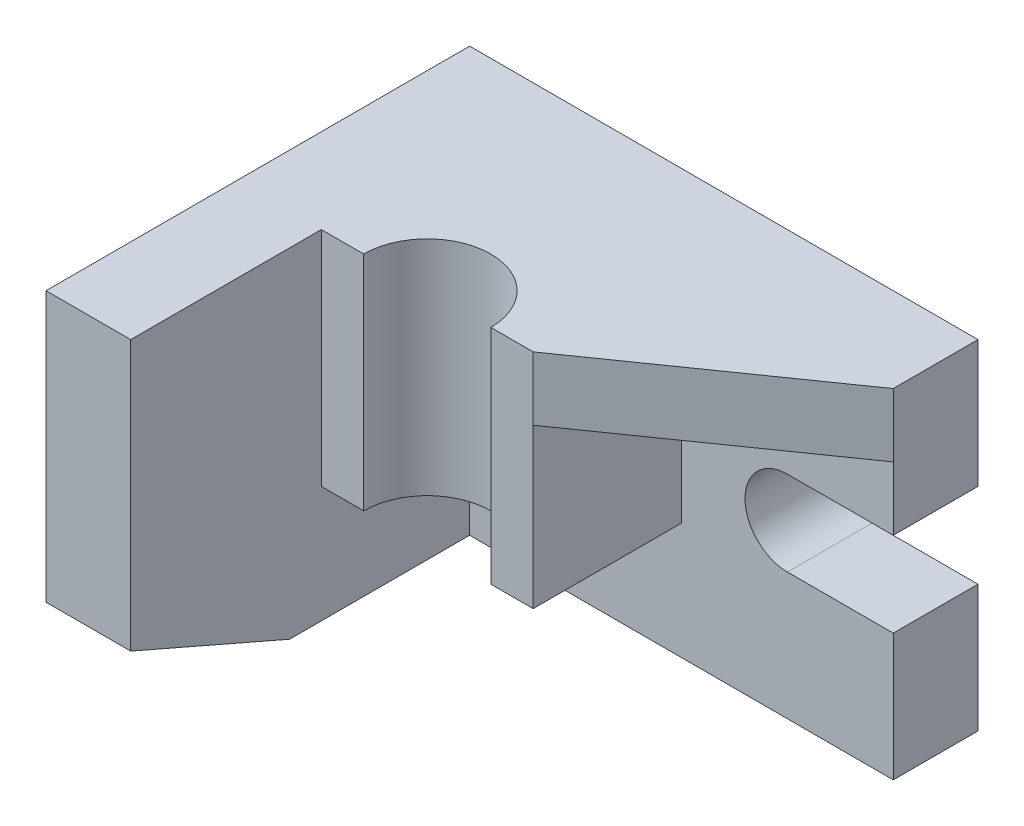
ISO-10303-21;
HEADER;
FILE_DESCRIPTION(('STEP AP214'),'2;1');
FILE_NAME('part.step','',(''),(''),'','','');
FILE_SCHEMA(('AUTOMOTIVE_DESIGN { 1 0 10303 214 1 1 1 1 }'));
ENDSEC;
DATA;
#1=APPLICATION_CONTEXT('core data for automotive mechanical design processes');
#2=APPLICATION_PROTOCOL_DEFINITION('international standard','automotive_design',2000,#1);
#3=PRODUCT_CONTEXT('',#1,'mechanical');
#4=PRODUCT('Part','Part','',(#3));
#5=PRODUCT_RELATED_PRODUCT_CATEGORY('part','',(#4));
#6=PRODUCT_DEFINITION_FORMATION('','',#4);
#7=PRODUCT_DEFINITION_CONTEXT('part definition',#1,'design');
#8=PRODUCT_DEFINITION('design','',#6,#7);
#9=PRODUCT_DEFINITION_SHAPE('','',#8);
#10=(LENGTH_UNIT() NAMED_UNIT(*) SI_UNIT(.MILLI.,.METRE.));
#11=(NAMED_UNIT(*) PLANE_ANGLE_UNIT() SI_UNIT($,.RADIAN.));
#12=(NAMED_UNIT(*) SI_UNIT($,.STERADIAN.) SOLID_ANGLE_UNIT());
#13=UNCERTAINTY_MEASURE_WITH_UNIT(LENGTH_MEASURE(1.E-05),#10,'distance_accuracy_value','');
#14=(GEOMETRIC_REPRESENTATION_CONTEXT(3) GLOBAL_UNCERTAINTY_ASSIGNED_CONTEXT((#13)) GLOBAL_UNIT_ASSIGNED_CONTEXT((#10,
#11,#12)) REPRESENTATION_CONTEXT('',''));
#15=CARTESIAN_POINT('',(0.,0.,0.));
#16=DIRECTION('',(0.,0.,1.));
#17=DIRECTION('',(1.,0.,0.));
#18=AXIS2_PLACEMENT_3D('',#15,#16,#17);
#19=CARTESIAN_POINT('',(-32.,-10.,28.));
#20=DIRECTION('',(0.,0.,1.));
#21=DIRECTION('',(1.,0.,0.));
#22=AXIS2_PLACEMENT_3D('',#19,#20,#21);
#23=PLANE('',#22);
#24=DIRECTION('',(0.,1.,0.));
#25=VECTOR('',#24,1.);
#26=CARTESIAN_POINT('',(0.,-32.,28.));
#27=LINE('',#26,#25);
#28=CARTESIAN_POINT('',(0.,-10.,28.));
#29=VERTEX_POINT('',#28);
#30=CARTESIAN_POINT('',(0.,32.,28.));
#31=VERTEX_POINT('',#30);
#32=EDGE_CURVE('E159',#29,#31,#27,.T.);
#33=ORIENTED_EDGE('',*,*,#32,.F.);
#34=DIRECTION('',(1.,0.,0.));
#35=VECTOR('',#34,1.);
#36=CARTESIAN_POINT('',(-32.,-10.,28.));
#37=LINE('',#36,#35);
#38=CARTESIAN_POINT('',(8.00000000000002,-10.,28.));
#39=VERTEX_POINT('',#38);
#40=EDGE_CURVE('E290',#29,#39,#37,.T.);
#41=ORIENTED_EDGE('',*,*,#40,.T.);
#42=DIRECTION('',(0.,1.,0.));
#43=VECTOR('',#42,1.);
#44=CARTESIAN_POINT('',(8.00000000000002,-10.,28.));
#45=LINE('',#44,#43);
#46=CARTESIAN_POINT('',(8.00000000000002,20.,28.));
#47=VERTEX_POINT('',#46);
#48=EDGE_CURVE('E192',#39,#47,#45,.T.);
#49=ORIENTED_EDGE('',*,*,#48,.T.);
#50=DIRECTION('',(0.,1.,0.));
#51=VECTOR('',#50,1.);
#52=CARTESIAN_POINT('',(8.00000000000002,20.,28.));
#53=LINE('',#52,#51);
#54=CARTESIAN_POINT('',(8.00000000000002,32.,28.));
#55=VERTEX_POINT('',#54);
#56=EDGE_CURVE('E179',#47,#55,#53,.T.);
#57=ORIENTED_EDGE('',*,*,#56,.T.);
#58=DIRECTION('',(1.,0.,0.));
#59=VECTOR('',#58,1.);
#60=CARTESIAN_POINT('',(-32.,32.,28.));
#61=LINE('',#60,#59);
#62=EDGE_CURVE('E172',#31,#55,#61,.T.);
#63=ORIENTED_EDGE('',*,*,#62,.F.);
#64=EDGE_LOOP('',(#33,#41,#49,#57,#63));
#65=FACE_BOUND('',#64,.T.);
#66=ADVANCED_FACE('F43',(#65),#23,.T.);
#67=CARTESIAN_POINT('',(48.,-32.,-16.));
#68=DIRECTION('',(1.,0.,0.));
#69=DIRECTION('',(0.,0.,-1.));
#70=AXIS2_PLACEMENT_3D('',#67,#68,#69);
#71=PLANE('',#70);
#72=DIRECTION('',(0.,1.,0.));
#73=VECTOR('',#72,1.);
#74=CARTESIAN_POINT('',(48.,-32.,-16.));
#75=LINE('',#74,#73);
#76=CARTESIAN_POINT('',(48.,-32.,-16.));
#77=VERTEX_POINT('',#76);
#78=CARTESIAN_POINT('',(48.,-8.,-16.));
#79=VERTEX_POINT('',#78);
#80=EDGE_CURVE('E224',#77,#79,#75,.T.);
#81=ORIENTED_EDGE('',*,*,#80,.T.);
#82=DIRECTION('',(0.,0.,1.));
#83=VECTOR('',#82,1.);
#84=CARTESIAN_POINT('',(48.,-8.,-16.));
#85=LINE('',#84,#83);
#86=CARTESIAN_POINT('',(48.,-8.,0.));
#87=VERTEX_POINT('',#86);
#88=EDGE_CURVE('E281',#79,#87,#85,.T.);
#89=ORIENTED_EDGE('',*,*,#88,.T.);
#90=DIRECTION('',(0.,1.,0.));
#91=VECTOR('',#90,1.);
#92=CARTESIAN_POINT('',(48.,-32.,0.));
#93=LINE('',#92,#91);
#94=CARTESIAN_POINT('',(48.,-32.,0.));
#95=VERTEX_POINT('',#94);
#96=EDGE_CURVE('E238',#95,#87,#93,.T.);
#97=ORIENTED_EDGE('',*,*,#96,.F.);
#98=DIRECTION('',(0.,0.,1.));
#99=VECTOR('',#98,1.);
#100=CARTESIAN_POINT('',(48.,-32.,-16.));
#101=LINE('',#100,#99);
#102=EDGE_CURVE('E243',#77,#95,#101,.T.);
#103=ORIENTED_EDGE('',*,*,#102,.F.);
#104=EDGE_LOOP('',(#81,#89,#97,#103));
#105=FACE_BOUND('',#104,.T.);
#106=ADVANCED_FACE('F313',(#105),#71,.T.);
#107=DIRECTION('',(0.,0.,1.));
#108=VECTOR('',#107,1.);
#109=CARTESIAN_POINT('',(48.,8.,-16.));
#110=LINE('',#109,#108);
#111=CARTESIAN_POINT('',(48.,8.,-16.));
#112=VERTEX_POINT('',#111);
#113=CARTESIAN_POINT('',(48.,8.,0.));
#114=VERTEX_POINT('',#113);
#115=EDGE_CURVE('E267',#112,#114,#110,.T.);
#116=ORIENTED_EDGE('',*,*,#115,.F.);
#117=CARTESIAN_POINT('',(48.,32.,-16.));
#118=VERTEX_POINT('',#117);
#119=EDGE_CURVE('E228',#112,#118,#75,.T.);
#120=ORIENTED_EDGE('',*,*,#119,.T.);
#121=DIRECTION('',(0.,0.,1.));
#122=VECTOR('',#121,1.);
#123=CARTESIAN_POINT('',(48.,32.,-16.));
#124=LINE('',#123,#122);
#125=CARTESIAN_POINT('',(48.,32.,0.));
#126=VERTEX_POINT('',#125);
#127=EDGE_CURVE('E237',#118,#126,#124,.T.);
#128=ORIENTED_EDGE('',*,*,#127,.T.);
#129=DIRECTION('',(0.,1.,0.));
#130=VECTOR('',#129,1.);
#131=CARTESIAN_POINT('',(48.,20.,0.));
#132=LINE('',#131,#130);
#133=CARTESIAN_POINT('',(48.,20.,0.));
#134=VERTEX_POINT('',#133);
#135=EDGE_CURVE('E180',#134,#126,#132,.T.);
#136=ORIENTED_EDGE('',*,*,#135,.F.);
#137=EDGE_CURVE('E219',#114,#134,#93,.T.);
#138=ORIENTED_EDGE('',*,*,#137,.F.);
#139=EDGE_LOOP('',(#116,#120,#128,#136,#138));
#140=FACE_BOUND('',#139,.T.);
#141=ADVANCED_FACE('F45',(#140),#71,.T.);
#142=CARTESIAN_POINT('',(-48.,-32.,-16.));
#143=DIRECTION('',(0.,-1.,0.));
#144=DIRECTION('',(0.,0.,-1.));
#145=AXIS2_PLACEMENT_3D('',#142,#143,#144);
#146=PLANE('',#145);
#147=DIRECTION('',(1.,0.,0.));
#148=VECTOR('',#147,1.);
#149=CARTESIAN_POINT('',(-48.,-32.,0.));
#150=LINE('',#149,#148);
#151=CARTESIAN_POINT('',(-32.,-32.,0.));
#152=VERTEX_POINT('',#151);
#153=EDGE_CURVE('E241',#152,#95,#150,.T.);
#154=ORIENTED_EDGE('',*,*,#153,.F.);
#155=DIRECTION('',(0.,0.,1.));
#156=VECTOR('',#155,1.);
#157=CARTESIAN_POINT('',(-32.,-32.,34.));
#158=LINE('',#157,#156);
#159=CARTESIAN_POINT('',(-32.,-32.,34.));
#160=VERTEX_POINT('',#159);
#161=EDGE_CURVE('E199',#152,#160,#158,.T.);
#162=ORIENTED_EDGE('',*,*,#161,.T.);
#163=DIRECTION('',(-1.,0.,0.));
#164=VECTOR('',#163,1.);
#165=CARTESIAN_POINT('',(-32.,-32.,34.));
#166=LINE('',#165,#164);
#167=CARTESIAN_POINT('',(-48.,-32.,34.));
#168=VERTEX_POINT('',#167);
#169=EDGE_CURVE('E211',#160,#168,#166,.T.);
#170=ORIENTED_EDGE('',*,*,#169,.T.);
#171=DIRECTION('',(0.,0.,1.));
#172=VECTOR('',#171,1.);
#173=CARTESIAN_POINT('',(-48.,-32.,-16.));
#174=LINE('',#173,#172);
#175=CARTESIAN_POINT('',(-48.,-32.,-16.));
#176=VERTEX_POINT('',#175);
#177=EDGE_CURVE('E247',#176,#168,#174,.T.);
#178=ORIENTED_EDGE('',*,*,#177,.F.);
#179=DIRECTION('',(1.,0.,0.));
#180=VECTOR('',#179,1.);
#181=CARTESIAN_POINT('',(-48.,-32.,-16.));
#182=LINE('',#181,#180);
#183=EDGE_CURVE('E234',#176,#77,#182,.T.);
#184=ORIENTED_EDGE('',*,*,#183,.T.);
#185=ORIENTED_EDGE('',*,*,#102,.T.);
#186=EDGE_LOOP('',(#154,#162,#170,#178,#184,#185));
#187=FACE_BOUND('',#186,.T.);
#188=ADVANCED_FACE('F309',(#187),#146,.T.);
#189=CARTESIAN_POINT('',(-48.,-32.,-16.));
#190=DIRECTION('',(-1.,0.,0.));
#191=DIRECTION('',(0.,0.,1.));
#192=AXIS2_PLACEMENT_3D('',#189,#190,#191);
#193=PLANE('',#192);
#194=ORIENTED_EDGE('',*,*,#177,.T.);
#195=DIRECTION('',(0.,0.398989949160386,0.916955299057153));
#196=VECTOR('',#195,1.);
#197=CARTESIAN_POINT('',(-48.,-18.946257372503,64.));
#198=LINE('',#197,#196);
#199=CARTESIAN_POINT('',(-48.,-18.946257372503,64.));
#200=VERTEX_POINT('',#199);
#201=EDGE_CURVE('E191',#168,#200,#198,.T.);
#202=ORIENTED_EDGE('',*,*,#201,.T.);
#203=DIRECTION('',(0.,1.,0.));
#204=VECTOR('',#203,1.);
#205=CARTESIAN_POINT('',(-48.,32.,64.));
#206=LINE('',#205,#204);
#207=CARTESIAN_POINT('',(-48.,32.,64.));
#208=VERTEX_POINT('',#207);
#209=EDGE_CURVE('E200',#200,#208,#206,.T.);
#210=ORIENTED_EDGE('',*,*,#209,.T.);
#211=DIRECTION('',(0.,0.,1.));
#212=VECTOR('',#211,1.);
#213=CARTESIAN_POINT('',(-48.,32.,-16.));
#214=LINE('',#213,#212);
#215=CARTESIAN_POINT('',(-48.,32.,-16.));
#216=VERTEX_POINT('',#215);
#217=EDGE_CURVE('E249',#216,#208,#214,.T.);
#218=ORIENTED_EDGE('',*,*,#217,.F.);
#219=DIRECTION('',(0.,-1.,0.));
#220=VECTOR('',#219,1.);
#221=CARTESIAN_POINT('',(-48.,-32.,-16.));
#222=LINE('',#221,#220);
#223=EDGE_CURVE('E231',#216,#176,#222,.T.);
#224=ORIENTED_EDGE('',*,*,#223,.T.);
#225=EDGE_LOOP('',(#194,#202,#210,#218,#224));
#226=FACE_BOUND('',#225,.T.);
#227=ADVANCED_FACE('F340',(#226),#193,.T.);
#228=CARTESIAN_POINT('',(-48.,32.,-16.));
#229=DIRECTION('',(0.,1.,0.));
#230=DIRECTION('',(0.,0.,1.));
#231=AXIS2_PLACEMENT_3D('',#228,#229,#230);
#232=PLANE('',#231);
#233=CARTESIAN_POINT('',(-12.,32.,28.));
#234=DIRECTION('',(0.,1.,0.));
#235=DIRECTION('',(0.,0.,1.));
#236=AXIS2_PLACEMENT_3D('',#233,#234,#235);
#237=CIRCLE('',#236,12.);
#238=CARTESIAN_POINT('',(-24.,32.,28.));
#239=VERTEX_POINT('',#238);
#240=EDGE_CURVE('E162',#31,#239,#237,.T.);
#241=ORIENTED_EDGE('',*,*,#240,.F.);
#242=ORIENTED_EDGE('',*,*,#62,.T.);
#243=DIRECTION('',(0.81923192051904,0.,-0.573462344363328));
#244=VECTOR('',#243,1.);
#245=CARTESIAN_POINT('',(8.00000000000002,32.,28.));
#246=LINE('',#245,#244);
#247=EDGE_CURVE('E272',#55,#126,#246,.T.);
#248=ORIENTED_EDGE('',*,*,#247,.T.);
#249=ORIENTED_EDGE('',*,*,#127,.F.);
#250=DIRECTION('',(-1.,0.,0.));
#251=VECTOR('',#250,1.);
#252=CARTESIAN_POINT('',(-48.,32.,-16.));
#253=LINE('',#252,#251);
#254=EDGE_CURVE('E227',#118,#216,#253,.T.);
#255=ORIENTED_EDGE('',*,*,#254,.T.);
#256=ORIENTED_EDGE('',*,*,#217,.T.);
#257=DIRECTION('',(-1.,0.,0.));
#258=VECTOR('',#257,1.);
#259=CARTESIAN_POINT('',(-32.,32.,64.));
#260=LINE('',#259,#258);
#261=CARTESIAN_POINT('',(-32.,32.,64.));
#262=VERTEX_POINT('',#261);
#263=EDGE_CURVE('E216',#262,#208,#260,.T.);
#264=ORIENTED_EDGE('',*,*,#263,.F.);
#265=DIRECTION('',(0.,0.,-1.));
#266=VECTOR('',#265,1.);
#267=CARTESIAN_POINT('',(-32.,32.,0.));
#268=LINE('',#267,#266);
#269=CARTESIAN_POINT('',(-32.,32.,28.));
#270=VERTEX_POINT('',#269);
#271=EDGE_CURVE('E209',#262,#270,#268,.T.);
#272=ORIENTED_EDGE('',*,*,#271,.T.);
#273=EDGE_CURVE('E175',#270,#239,#61,.T.);
#274=ORIENTED_EDGE('',*,*,#273,.T.);
#275=EDGE_LOOP('',(#241,#242,#248,#249,#255,#256,#264,#272,#274));
#276=FACE_BOUND('',#275,.T.);
#277=ADVANCED_FACE('F170',(#276),#232,.T.);
#278=CARTESIAN_POINT('',(0.,0.,-16.));
#279=DIRECTION('',(0.,0.,-1.));
#280=DIRECTION('',(-1.,0.,0.));
#281=AXIS2_PLACEMENT_3D('',#278,#279,#280);
#282=PLANE('',#281);
#283=DIRECTION('',(-1.,0.,0.));
#284=VECTOR('',#283,1.);
#285=CARTESIAN_POINT('',(0.,8.,-16.));
#286=LINE('',#285,#284);
#287=CARTESIAN_POINT('',(28.,8.,-16.));
#288=VERTEX_POINT('',#287);
#289=EDGE_CURVE('E166',#112,#288,#286,.T.);
#290=ORIENTED_EDGE('',*,*,#289,.T.);
#291=CARTESIAN_POINT('',(28.,0.,-16.));
#292=DIRECTION('',(0.,0.,1.));
#293=DIRECTION('',(1.,0.,0.));
#294=AXIS2_PLACEMENT_3D('',#291,#292,#293);
#295=CIRCLE('',#294,8.);
#296=CARTESIAN_POINT('',(28.,-8.,-16.));
#297=VERTEX_POINT('',#296);
#298=EDGE_CURVE('E345',#288,#297,#295,.T.);
#299=ORIENTED_EDGE('',*,*,#298,.T.);
#300=DIRECTION('',(-1.,0.,0.));
#301=VECTOR('',#300,1.);
#302=CARTESIAN_POINT('',(0.,-8.00000000000001,-16.));
#303=LINE('',#302,#301);
#304=EDGE_CURVE('E323',#79,#297,#303,.T.);
#305=ORIENTED_EDGE('',*,*,#304,.F.);
#306=ORIENTED_EDGE('',*,*,#80,.F.);
#307=ORIENTED_EDGE('',*,*,#183,.F.);
#308=ORIENTED_EDGE('',*,*,#223,.F.);
#309=ORIENTED_EDGE('',*,*,#254,.F.);
#310=ORIENTED_EDGE('',*,*,#119,.F.);
#311=EDGE_LOOP('',(#290,#299,#305,#306,#307,#308,#309,#310));
#312=FACE_BOUND('',#311,.T.);
#313=ADVANCED_FACE('F343',(#312),#282,.T.);
#314=CARTESIAN_POINT('',(0.,0.,0.));
#315=DIRECTION('',(0.,0.,-1.));
#316=DIRECTION('',(-1.,0.,0.));
#317=AXIS2_PLACEMENT_3D('',#314,#315,#316);
#318=PLANE('',#317);
#319=CARTESIAN_POINT('',(28.,0.,0.));
#320=DIRECTION('',(0.,0.,-1.));
#321=DIRECTION('',(-1.,0.,0.));
#322=AXIS2_PLACEMENT_3D('',#319,#320,#321);
#323=CIRCLE('',#322,8.);
#324=CARTESIAN_POINT('',(28.,-8.,0.));
#325=VERTEX_POINT('',#324);
#326=CARTESIAN_POINT('',(28.,8.,0.));
#327=VERTEX_POINT('',#326);
#328=EDGE_CURVE('E246',#325,#327,#323,.T.);
#329=ORIENTED_EDGE('',*,*,#328,.T.);
#330=DIRECTION('',(1.,0.,0.));
#331=VECTOR('',#330,1.);
#332=CARTESIAN_POINT('',(0.,8.,0.));
#333=LINE('',#332,#331);
#334=EDGE_CURVE('E51',#327,#114,#333,.T.);
#335=ORIENTED_EDGE('',*,*,#334,.T.);
#336=ORIENTED_EDGE('',*,*,#137,.T.);
#337=DIRECTION('',(-1.,0.,0.));
#338=VECTOR('',#337,1.);
#339=CARTESIAN_POINT('',(48.,20.,0.));
#340=LINE('',#339,#338);
#341=CARTESIAN_POINT('',(8.00000000000002,20.,0.));
#342=VERTEX_POINT('',#341);
#343=EDGE_CURVE('E284',#134,#342,#340,.T.);
#344=ORIENTED_EDGE('',*,*,#343,.T.);
#345=DIRECTION('',(0.,1.,0.));
#346=VECTOR('',#345,1.);
#347=CARTESIAN_POINT('',(8.00000000000002,-10.,0.));
#348=LINE('',#347,#346);
#349=CARTESIAN_POINT('',(8.00000000000002,-10.,0.));
#350=VERTEX_POINT('',#349);
#351=EDGE_CURVE('E188',#350,#342,#348,.T.);
#352=ORIENTED_EDGE('',*,*,#351,.F.);
#353=DIRECTION('',(-1.,0.,0.));
#354=VECTOR('',#353,1.);
#355=CARTESIAN_POINT('',(-32.,-10.,0.));
#356=LINE('',#355,#354);
#357=CARTESIAN_POINT('',(-32.,-10.,0.));
#358=VERTEX_POINT('',#357);
#359=EDGE_CURVE('E186',#350,#358,#356,.T.);
#360=ORIENTED_EDGE('',*,*,#359,.T.);
#361=DIRECTION('',(0.,-1.,0.));
#362=VECTOR('',#361,1.);
#363=CARTESIAN_POINT('',(-32.,-32.,0.));
#364=LINE('',#363,#362);
#365=EDGE_CURVE('E197',#358,#152,#364,.T.);
#366=ORIENTED_EDGE('',*,*,#365,.T.);
#367=ORIENTED_EDGE('',*,*,#153,.T.);
#368=ORIENTED_EDGE('',*,*,#96,.T.);
#369=DIRECTION('',(1.,0.,0.));
#370=VECTOR('',#369,1.);
#371=CARTESIAN_POINT('',(0.,-8.00000000000001,0.));
#372=LINE('',#371,#370);
#373=EDGE_CURVE('E255',#325,#87,#372,.T.);
#374=ORIENTED_EDGE('',*,*,#373,.F.);
#375=EDGE_LOOP('',(#329,#335,#336,#344,#352,#360,#366,#367,#368,#374));
#376=FACE_BOUND('',#375,.T.);
#377=ADVANCED_FACE('F259',(#376),#318,.F.);
#378=CARTESIAN_POINT('',(-32.,32.,64.));
#379=DIRECTION('',(0.,0.,1.));
#380=DIRECTION('',(0.,-1.,0.));
#381=AXIS2_PLACEMENT_3D('',#378,#379,#380);
#382=PLANE('',#381);
#383=ORIENTED_EDGE('',*,*,#209,.F.);
#384=DIRECTION('',(-1.,0.,0.));
#385=VECTOR('',#384,1.);
#386=CARTESIAN_POINT('',(-32.,-18.946257372503,64.));
#387=LINE('',#386,#385);
#388=CARTESIAN_POINT('',(-32.,-18.946257372503,64.));
#389=VERTEX_POINT('',#388);
#390=EDGE_CURVE('E220',#389,#200,#387,.T.);
#391=ORIENTED_EDGE('',*,*,#390,.F.);
#392=DIRECTION('',(0.,1.,0.));
#393=VECTOR('',#392,1.);
#394=CARTESIAN_POINT('',(-32.,32.,64.));
#395=LINE('',#394,#393);
#396=EDGE_CURVE('E206',#389,#262,#395,.T.);
#397=ORIENTED_EDGE('',*,*,#396,.T.);
#398=ORIENTED_EDGE('',*,*,#263,.T.);
#399=EDGE_LOOP('',(#383,#391,#397,#398));
#400=FACE_BOUND('',#399,.T.);
#401=ADVANCED_FACE('F333',(#400),#382,.T.);
#402=CARTESIAN_POINT('',(-32.,-18.946257372503,64.));
#403=DIRECTION('',(0.,-0.916955299057153,0.398989949160387));
#404=DIRECTION('',(0.,-0.398989949160386,-0.916955299057153));
#405=AXIS2_PLACEMENT_3D('',#402,#403,#404);
#406=PLANE('',#405);
#407=ORIENTED_EDGE('',*,*,#201,.F.);
#408=ORIENTED_EDGE('',*,*,#169,.F.);
#409=DIRECTION('',(0.,0.398989949160386,0.916955299057153));
#410=VECTOR('',#409,1.);
#411=CARTESIAN_POINT('',(-32.,-18.946257372503,64.));
#412=LINE('',#411,#410);
#413=EDGE_CURVE('E203',#160,#389,#412,.T.);
#414=ORIENTED_EDGE('',*,*,#413,.T.);
#415=ORIENTED_EDGE('',*,*,#390,.T.);
#416=EDGE_LOOP('',(#407,#408,#414,#415));
#417=FACE_BOUND('',#416,.T.);
#418=ADVANCED_FACE('F336',(#417),#406,.T.);
#419=CARTESIAN_POINT('',(-32.,0.,0.));
#420=DIRECTION('',(1.,0.,0.));
#421=DIRECTION('',(0.,0.,-1.));
#422=AXIS2_PLACEMENT_3D('',#419,#420,#421);
#423=PLANE('',#422);
#424=DIRECTION('',(0.,1.,0.));
#425=VECTOR('',#424,1.);
#426=CARTESIAN_POINT('',(-32.,-10.,28.));
#427=LINE('',#426,#425);
#428=CARTESIAN_POINT('',(-32.,-10.,28.));
#429=VERTEX_POINT('',#428);
#430=EDGE_CURVE('E194',#429,#270,#427,.T.);
#431=ORIENTED_EDGE('',*,*,#430,.T.);
#432=ORIENTED_EDGE('',*,*,#271,.F.);
#433=ORIENTED_EDGE('',*,*,#396,.F.);
#434=ORIENTED_EDGE('',*,*,#413,.F.);
#435=ORIENTED_EDGE('',*,*,#161,.F.);
#436=ORIENTED_EDGE('',*,*,#365,.F.);
#437=DIRECTION('',(0.,0.,1.));
#438=VECTOR('',#437,1.);
#439=CARTESIAN_POINT('',(-32.,-10.,0.));
#440=LINE('',#439,#438);
#441=EDGE_CURVE('E182',#358,#429,#440,.T.);
#442=ORIENTED_EDGE('',*,*,#441,.T.);
#443=EDGE_LOOP('',(#431,#432,#433,#434,#435,#436,#442));
#444=FACE_BOUND('',#443,.T.);
#445=ADVANCED_FACE('F304',(#444),#423,.T.);
#446=CARTESIAN_POINT('',(8.00000000000002,-10.,0.));
#447=DIRECTION('',(1.,0.,0.));
#448=DIRECTION('',(0.,0.,-1.));
#449=AXIS2_PLACEMENT_3D('',#446,#447,#448);
#450=PLANE('',#449);
#451=DIRECTION('',(0.,0.,1.));
#452=VECTOR('',#451,1.);
#453=CARTESIAN_POINT('',(8.00000000000002,20.,0.));
#454=LINE('',#453,#452);
#455=EDGE_CURVE('E277',#342,#47,#454,.T.);
#456=ORIENTED_EDGE('',*,*,#455,.T.);
#457=ORIENTED_EDGE('',*,*,#48,.F.);
#458=DIRECTION('',(0.,0.,-1.));
#459=VECTOR('',#458,1.);
#460=CARTESIAN_POINT('',(8.00000000000002,-10.,0.));
#461=LINE('',#460,#459);
#462=EDGE_CURVE('E293',#39,#350,#461,.T.);
#463=ORIENTED_EDGE('',*,*,#462,.T.);
#464=ORIENTED_EDGE('',*,*,#351,.T.);
#465=EDGE_LOOP('',(#456,#457,#463,#464));
#466=FACE_BOUND('',#465,.T.);
#467=ADVANCED_FACE('F325',(#466),#450,.T.);
#468=DIRECTION('',(0.,1.,0.));
#469=VECTOR('',#468,1.);
#470=CARTESIAN_POINT('',(-24.,-32.,28.));
#471=LINE('',#470,#469);
#472=CARTESIAN_POINT('',(-24.,-10.,28.));
#473=VERTEX_POINT('',#472);
#474=EDGE_CURVE('E58',#239,#473,#471,.F.);
#475=ORIENTED_EDGE('',*,*,#474,.F.);
#476=ORIENTED_EDGE('',*,*,#273,.F.);
#477=ORIENTED_EDGE('',*,*,#430,.F.);
#478=EDGE_CURVE('E291',#429,#473,#37,.T.);
#479=ORIENTED_EDGE('',*,*,#478,.T.);
#480=EDGE_LOOP('',(#475,#476,#477,#479));
#481=FACE_BOUND('',#480,.T.);
#482=ADVANCED_FACE('F329',(#481),#23,.T.);
#483=CARTESIAN_POINT('',(0.,-10.,0.));
#484=DIRECTION('',(0.,1.,0.));
#485=DIRECTION('',(0.,0.,1.));
#486=AXIS2_PLACEMENT_3D('',#483,#484,#485);
#487=PLANE('',#486);
#488=ORIENTED_EDGE('',*,*,#40,.F.);
#489=CARTESIAN_POINT('',(-12.,-10.,28.));
#490=DIRECTION('',(0.,1.,0.));
#491=DIRECTION('',(0.,0.,1.));
#492=AXIS2_PLACEMENT_3D('',#489,#490,#491);
#493=CIRCLE('',#492,12.);
#494=EDGE_CURVE('E11',#29,#473,#493,.T.);
#495=ORIENTED_EDGE('',*,*,#494,.T.);
#496=ORIENTED_EDGE('',*,*,#478,.F.);
#497=ORIENTED_EDGE('',*,*,#441,.F.);
#498=ORIENTED_EDGE('',*,*,#359,.F.);
#499=ORIENTED_EDGE('',*,*,#462,.F.);
#500=EDGE_LOOP('',(#488,#495,#496,#497,#498,#499));
#501=FACE_BOUND('',#500,.T.);
#502=ADVANCED_FACE('F326',(#501),#487,.F.);
#503=CARTESIAN_POINT('',(8.00000000000002,20.,28.));
#504=DIRECTION('',(0.573462344363328,0.,0.81923192051904));
#505=DIRECTION('',(0.81923192051904,0.,-0.573462344363328));
#506=AXIS2_PLACEMENT_3D('',#503,#504,#505);
#507=PLANE('',#506);
#508=ORIENTED_EDGE('',*,*,#247,.F.);
#509=ORIENTED_EDGE('',*,*,#56,.F.);
#510=DIRECTION('',(0.81923192051904,0.,-0.573462344363328));
#511=VECTOR('',#510,1.);
#512=CARTESIAN_POINT('',(8.00000000000002,20.,28.));
#513=LINE('',#512,#511);
#514=EDGE_CURVE('E274',#47,#134,#513,.T.);
#515=ORIENTED_EDGE('',*,*,#514,.T.);
#516=ORIENTED_EDGE('',*,*,#135,.T.);
#517=EDGE_LOOP('',(#508,#509,#515,#516));
#518=FACE_BOUND('',#517,.T.);
#519=ADVANCED_FACE('F271',(#518),#507,.T.);
#520=CARTESIAN_POINT('',(0.,20.,0.));
#521=DIRECTION('',(0.,-1.,0.));
#522=DIRECTION('',(0.,0.,-1.));
#523=AXIS2_PLACEMENT_3D('',#520,#521,#522);
#524=PLANE('',#523);
#525=ORIENTED_EDGE('',*,*,#455,.F.);
#526=ORIENTED_EDGE('',*,*,#343,.F.);
#527=ORIENTED_EDGE('',*,*,#514,.F.);
#528=EDGE_LOOP('',(#525,#526,#527));
#529=FACE_BOUND('',#528,.T.);
#530=ADVANCED_FACE('F360',(#529),#524,.T.);
#531=CARTESIAN_POINT('',(0.,8.,-16.));
#532=DIRECTION('',(0.,1.,0.));
#533=DIRECTION('',(-1.,0.,0.));
#534=AXIS2_PLACEMENT_3D('',#531,#532,#533);
#535=PLANE('',#534);
#536=DIRECTION('',(0.,0.,1.));
#537=VECTOR('',#536,1.);
#538=CARTESIAN_POINT('',(28.,8.,-16.));
#539=LINE('',#538,#537);
#540=EDGE_CURVE('E65',#288,#327,#539,.T.);
#541=ORIENTED_EDGE('',*,*,#540,.F.);
#542=ORIENTED_EDGE('',*,*,#289,.F.);
#543=ORIENTED_EDGE('',*,*,#115,.T.);
#544=ORIENTED_EDGE('',*,*,#334,.F.);
#545=EDGE_LOOP('',(#541,#542,#543,#544));
#546=FACE_BOUND('',#545,.T.);
#547=ADVANCED_FACE('F350',(#546),#535,.F.);
#548=CARTESIAN_POINT('',(0.,-8.00000000000001,-16.));
#549=DIRECTION('',(0.,1.,0.));
#550=DIRECTION('',(-1.,0.,0.));
#551=AXIS2_PLACEMENT_3D('',#548,#549,#550);
#552=PLANE('',#551);
#553=ORIENTED_EDGE('',*,*,#373,.T.);
#554=ORIENTED_EDGE('',*,*,#88,.F.);
#555=ORIENTED_EDGE('',*,*,#304,.T.);
#556=DIRECTION('',(0.,0.,1.));
#557=VECTOR('',#556,1.);
#558=CARTESIAN_POINT('',(28.,-8.,-16.));
#559=LINE('',#558,#557);
#560=EDGE_CURVE('E317',#297,#325,#559,.T.);
#561=ORIENTED_EDGE('',*,*,#560,.T.);
#562=EDGE_LOOP('',(#553,#554,#555,#561));
#563=FACE_BOUND('',#562,.T.);
#564=ADVANCED_FACE('F352',(#563),#552,.T.);
#565=CARTESIAN_POINT('',(28.,0.,-16.));
#566=DIRECTION('',(0.,0.,1.));
#567=DIRECTION('',(1.,0.,0.));
#568=AXIS2_PLACEMENT_3D('',#565,#566,#567);
#569=CYLINDRICAL_SURFACE('',#568,8.);
#570=ORIENTED_EDGE('',*,*,#560,.F.);
#571=ORIENTED_EDGE('',*,*,#298,.F.);
#572=ORIENTED_EDGE('',*,*,#540,.T.);
#573=ORIENTED_EDGE('',*,*,#328,.F.);
#574=EDGE_LOOP('',(#570,#571,#572,#573));
#575=FACE_BOUND('',#574,.T.);
#576=ADVANCED_FACE('F351',(#575),#569,.F.);
#577=CARTESIAN_POINT('',(-12.,-32.,28.));
#578=DIRECTION('',(0.,1.,0.));
#579=DIRECTION('',(0.,0.,1.));
#580=AXIS2_PLACEMENT_3D('',#577,#578,#579);
#581=CYLINDRICAL_SURFACE('',#580,12.);
#582=ORIENTED_EDGE('',*,*,#32,.T.);
#583=ORIENTED_EDGE('',*,*,#240,.T.);
#584=ORIENTED_EDGE('',*,*,#474,.T.);
#585=ORIENTED_EDGE('',*,*,#494,.F.);
#586=EDGE_LOOP('',(#582,#583,#584,#585));
#587=FACE_BOUND('',#586,.T.);
#588=ADVANCED_FACE('F161',(#587),#581,.F.);
#589=CLOSED_SHELL('',(#66,#106,#141,#188,#227,#277,#313,#377,#401,#418,#445,#467,#482,#502,#519,
#530,#547,#564,#576,#588));
#590=MANIFOLD_SOLID_BREP('B2',#589);
#591=ADVANCED_BREP_SHAPE_REPRESENTATION('',(#18,#590),#14);
#592=SHAPE_DEFINITION_REPRESENTATION(#9,#591);
ENDSEC;
END-ISO-10303-21;
